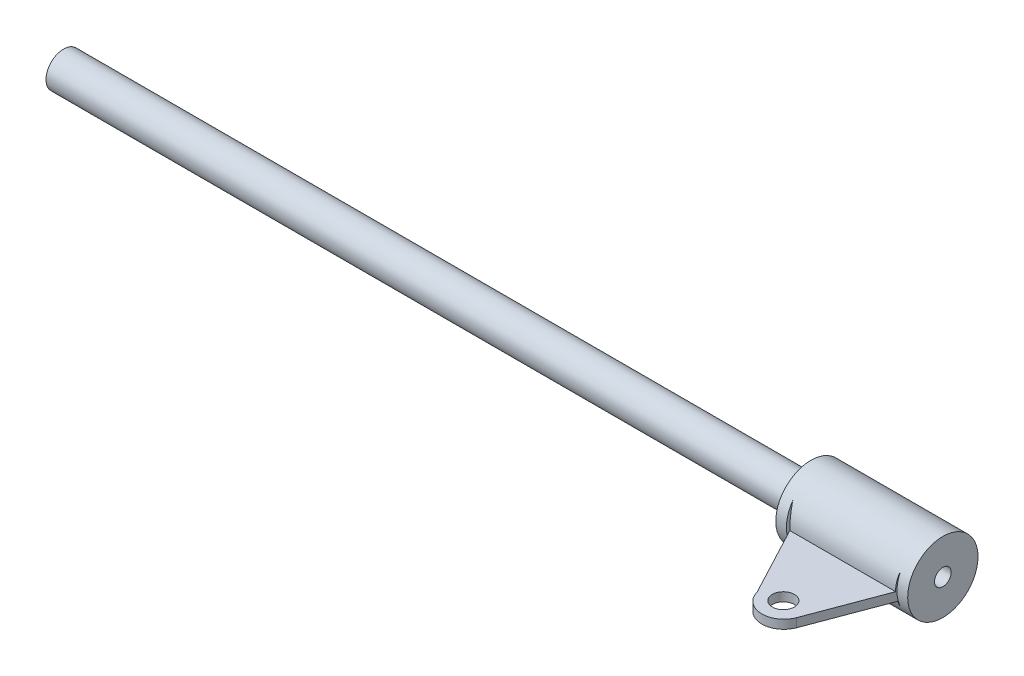
ISO-10303-21;
HEADER;
FILE_DESCRIPTION(('STEP AP214'),'2;1');
FILE_NAME('part.step','',(''),(''),'','','');
FILE_SCHEMA(('AUTOMOTIVE_DESIGN { 1 0 10303 214 1 1 1 1 }'));
ENDSEC;
DATA;
#1=APPLICATION_CONTEXT('core data for automotive mechanical design processes');
#2=APPLICATION_PROTOCOL_DEFINITION('international standard','automotive_design',2000,#1);
#3=PRODUCT_CONTEXT('',#1,'mechanical');
#4=PRODUCT('Part','Part','',(#3));
#5=PRODUCT_RELATED_PRODUCT_CATEGORY('part','',(#4));
#6=PRODUCT_DEFINITION_FORMATION('','',#4);
#7=PRODUCT_DEFINITION_CONTEXT('part definition',#1,'design');
#8=PRODUCT_DEFINITION('design','',#6,#7);
#9=PRODUCT_DEFINITION_SHAPE('','',#8);
#10=(LENGTH_UNIT() NAMED_UNIT(*) SI_UNIT(.MILLI.,.METRE.));
#11=(NAMED_UNIT(*) PLANE_ANGLE_UNIT() SI_UNIT($,.RADIAN.));
#12=(NAMED_UNIT(*) SI_UNIT($,.STERADIAN.) SOLID_ANGLE_UNIT());
#13=UNCERTAINTY_MEASURE_WITH_UNIT(LENGTH_MEASURE(1.E-05),#10,'distance_accuracy_value','');
#14=(GEOMETRIC_REPRESENTATION_CONTEXT(3) GLOBAL_UNCERTAINTY_ASSIGNED_CONTEXT((#13)) GLOBAL_UNIT_ASSIGNED_CONTEXT((#10,
#11,#12)) REPRESENTATION_CONTEXT('',''));
#15=CARTESIAN_POINT('',(0.,0.,0.));
#16=DIRECTION('',(0.,0.,1.));
#17=DIRECTION('',(1.,0.,0.));
#18=AXIS2_PLACEMENT_3D('',#15,#16,#17);
#19=CARTESIAN_POINT('',(1650.,55.7548476454296,0.));
#20=DIRECTION('',(1.,0.,0.));
#21=DIRECTION('',(0.,1.,0.));
#22=AXIS2_PLACEMENT_3D('',#19,#20,#21);
#23=CYLINDRICAL_SURFACE('',#22,80.0000000000002);
#24=CARTESIAN_POINT('',(1350.,55.7548476454296,0.));
#25=DIRECTION('',(1.,0.,0.));
#26=DIRECTION('',(0.,1.,0.));
#27=AXIS2_PLACEMENT_3D('',#24,#25,#26);
#28=CIRCLE('',#27,80.0000000000002);
#29=CARTESIAN_POINT('',(1350.,135.75484764543,0.));
#30=VERTEX_POINT('',#29);
#31=EDGE_CURVE('E189',#30,#30,#28,.T.);
#32=ORIENTED_EDGE('',*,*,#31,.T.);
#33=EDGE_LOOP('',(#32));
#34=FACE_BOUND('',#33,.T.);
#35=CARTESIAN_POINT('',(1650.,55.7548476454296,0.));
#36=DIRECTION('',(1.,0.,0.));
#37=DIRECTION('',(0.,1.,0.));
#38=AXIS2_PLACEMENT_3D('',#35,#36,#37);
#39=CIRCLE('',#38,80.0000000000001);
#40=CARTESIAN_POINT('',(1650.,135.75484764543,0.));
#41=VERTEX_POINT('',#40);
#42=EDGE_CURVE('E187',#41,#41,#39,.T.);
#43=ORIENTED_EDGE('',*,*,#42,.F.);
#44=EDGE_LOOP('',(#43));
#45=FACE_BOUND('',#44,.T.);
#46=CARTESIAN_POINT('',(1625.63364270783,55.7548476454296,0.));
#47=DIRECTION('',(1.,0.,0.));
#48=DIRECTION('',(0.,0.,-1.));
#49=AXIS2_PLACEMENT_3D('',#46,#47,#48);
#50=CIRCLE('',#49,80.0000000000002);
#51=CARTESIAN_POINT('',(1625.63364270783,90.8074530030054,71.9118547782358));
#52=VERTEX_POINT('',#51);
#53=CARTESIAN_POINT('',(1625.63364270783,20.7022422878538,71.9118547782358));
#54=VERTEX_POINT('',#53);
#55=EDGE_CURVE('E12',#52,#54,#50,.T.);
#56=ORIENTED_EDGE('',*,*,#55,.T.);
#57=CARTESIAN_POINT('',(1652.62193285122,55.7548476454296,0.));
#58=DIRECTION('',(-0.936237784607447,0.,-0.351367059744277));
#59=DIRECTION('',(0.351367059744278,0.,-0.936237784607448));
#60=AXIS2_PLACEMENT_3D('',#57,#58,#59);
#61=ELLIPSE('',#60,85.4483778750108,80.0000000000002);
#62=CARTESIAN_POINT('',(1623.82183479907,33.1485242621909,76.7395213895192));
#63=VERTEX_POINT('',#62);
#64=EDGE_CURVE('E155',#54,#63,#61,.T.);
#65=ORIENTED_EDGE('',*,*,#64,.T.);
#66=DIRECTION('',(1.,0.,0.));
#67=VECTOR('',#66,1.);
#68=CARTESIAN_POINT('',(1650.,33.1485242621909,76.7395213895191));
#69=LINE('',#68,#67);
#70=CARTESIAN_POINT('',(1380.23322892771,33.1485242621909,76.7395213895191));
#71=VERTEX_POINT('',#70);
#72=EDGE_CURVE('E149',#71,#63,#69,.T.);
#73=ORIENTED_EDGE('',*,*,#72,.F.);
#74=CARTESIAN_POINT('',(1339.5691789963,55.7548476454296,0.));
#75=DIRECTION('',(0.883610518249531,0.,-0.468222652205973));
#76=DIRECTION('',(0.468222652205973,0.,0.883610518249531));
#77=AXIS2_PLACEMENT_3D('',#74,#75,#76);
#78=ELLIPSE('',#77,90.5376275493907,80.0000000000002);
#79=CARTESIAN_POINT('',(1374.27765575097,9.82341564149599,65.500408808404));
#80=VERTEX_POINT('',#79);
#81=EDGE_CURVE('E142',#71,#80,#78,.T.);
#82=ORIENTED_EDGE('',*,*,#81,.T.);
#83=CARTESIAN_POINT('',(1374.27765575097,55.7548476454296,0.));
#84=DIRECTION('',(-1.,0.,0.));
#85=DIRECTION('',(0.,0.,1.));
#86=AXIS2_PLACEMENT_3D('',#83,#84,#85);
#87=CIRCLE('',#86,80.0000000000002);
#88=CARTESIAN_POINT('',(1374.27765575097,101.686279649363,65.500408808404));
#89=VERTEX_POINT('',#88);
#90=EDGE_CURVE('E88',#80,#89,#87,.T.);
#91=ORIENTED_EDGE('',*,*,#90,.T.);
#92=CARTESIAN_POINT('',(1381.93844393506,53.148524262191,79.9575329685828));
#93=VERTEX_POINT('',#92);
#94=EDGE_CURVE('E144',#89,#93,#78,.T.);
#95=ORIENTED_EDGE('',*,*,#94,.T.);
#96=DIRECTION('',(1.,0.,0.));
#97=VECTOR('',#96,1.);
#98=CARTESIAN_POINT('',(1650.,53.148524262191,79.9575329685828));
#99=LINE('',#98,#97);
#100=CARTESIAN_POINT('',(1622.61412529904,53.148524262191,79.9575329685828));
#101=VERTEX_POINT('',#100);
#102=EDGE_CURVE('E205',#101,#93,#99,.F.);
#103=ORIENTED_EDGE('',*,*,#102,.F.);
#104=EDGE_CURVE('E150',#101,#52,#61,.T.);
#105=ORIENTED_EDGE('',*,*,#104,.T.);
#106=EDGE_LOOP('',(#56,#65,#73,#82,#91,#95,#103,#105));
#107=FACE_BOUND('',#106,.T.);
#108=ADVANCED_FACE('F80',(#34,#45,#107),#23,.T.);
#109=CARTESIAN_POINT('',(-350.,15.7548476454294,0.));
#110=DIRECTION('',(1.,0.,0.));
#111=DIRECTION('',(0.,1.,0.));
#112=AXIS2_PLACEMENT_3D('',#109,#110,#111);
#113=PLANE('',#112);
#114=CARTESIAN_POINT('',(-350.,55.7548476454296,0.));
#115=DIRECTION('',(1.,0.,0.));
#116=DIRECTION('',(0.,0.,-1.));
#117=AXIS2_PLACEMENT_3D('',#114,#115,#116);
#118=CIRCLE('',#117,19.05);
#119=CARTESIAN_POINT('',(-350.,55.7548476454296,-19.05));
#120=VERTEX_POINT('',#119);
#121=EDGE_CURVE('E168',#120,#120,#118,.T.);
#122=ORIENTED_EDGE('',*,*,#121,.T.);
#123=EDGE_LOOP('',(#122));
#124=FACE_BOUND('',#123,.T.);
#125=CARTESIAN_POINT('',(-350.,55.7548476454294,0.));
#126=DIRECTION('',(1.,0.,0.));
#127=DIRECTION('',(0.,1.,0.));
#128=AXIS2_PLACEMENT_3D('',#125,#126,#127);
#129=CIRCLE('',#128,40.);
#130=CARTESIAN_POINT('',(-350.,95.7548476454294,0.));
#131=VERTEX_POINT('',#130);
#132=EDGE_CURVE('E202',#131,#131,#129,.T.);
#133=ORIENTED_EDGE('',*,*,#132,.F.);
#134=EDGE_LOOP('',(#133));
#135=FACE_BOUND('',#134,.T.);
#136=ADVANCED_FACE('F82',(#124,#135),#113,.F.);
#137=CARTESIAN_POINT('',(1650.,55.7548476454296,0.));
#138=DIRECTION('',(1.,0.,0.));
#139=DIRECTION('',(0.,1.,0.));
#140=AXIS2_PLACEMENT_3D('',#137,#138,#139);
#141=CYLINDRICAL_SURFACE('',#140,40.0000000000001);
#142=CARTESIAN_POINT('',(1350.,55.7548476454296,0.));
#143=DIRECTION('',(1.,0.,0.));
#144=DIRECTION('',(0.,1.,0.));
#145=AXIS2_PLACEMENT_3D('',#142,#143,#144);
#146=CIRCLE('',#145,40.0000000000002);
#147=CARTESIAN_POINT('',(1350.,95.7548476454298,0.));
#148=VERTEX_POINT('',#147);
#149=EDGE_CURVE('E193',#148,#148,#146,.T.);
#150=ORIENTED_EDGE('',*,*,#149,.F.);
#151=EDGE_LOOP('',(#150));
#152=FACE_BOUND('',#151,.T.);
#153=ORIENTED_EDGE('',*,*,#132,.T.);
#154=EDGE_LOOP('',(#153));
#155=FACE_BOUND('',#154,.T.);
#156=ADVANCED_FACE('F244',(#152,#155),#141,.T.);
#157=CARTESIAN_POINT('',(1350.,-24.2451523545706,0.));
#158=DIRECTION('',(1.,0.,0.));
#159=DIRECTION('',(0.,1.,0.));
#160=AXIS2_PLACEMENT_3D('',#157,#158,#159);
#161=PLANE('',#160);
#162=ORIENTED_EDGE('',*,*,#31,.F.);
#163=EDGE_LOOP('',(#162));
#164=FACE_BOUND('',#163,.T.);
#165=ORIENTED_EDGE('',*,*,#149,.T.);
#166=EDGE_LOOP('',(#165));
#167=FACE_BOUND('',#166,.T.);
#168=ADVANCED_FACE('F183',(#164,#167),#161,.F.);
#169=CARTESIAN_POINT('',(1650.,-24.2451523545705,0.));
#170=DIRECTION('',(-1.,0.,0.));
#171=DIRECTION('',(0.,-1.,0.));
#172=AXIS2_PLACEMENT_3D('',#169,#170,#171);
#173=PLANE('',#172);
#174=CARTESIAN_POINT('',(1650.,55.7548476454296,0.));
#175=DIRECTION('',(1.,0.,0.));
#176=DIRECTION('',(0.,0.,-1.));
#177=AXIS2_PLACEMENT_3D('',#174,#175,#176);
#178=CIRCLE('',#177,19.05);
#179=CARTESIAN_POINT('',(1650.,55.7548476454296,-19.05));
#180=VERTEX_POINT('',#179);
#181=EDGE_CURVE('E171',#180,#180,#178,.T.);
#182=ORIENTED_EDGE('',*,*,#181,.F.);
#183=EDGE_LOOP('',(#182));
#184=FACE_BOUND('',#183,.T.);
#185=ORIENTED_EDGE('',*,*,#42,.T.);
#186=EDGE_LOOP('',(#185));
#187=FACE_BOUND('',#186,.T.);
#188=ADVANCED_FACE('F179',(#184,#187),#173,.F.);
#189=CARTESIAN_POINT('',(1625.3013802483,33.1485242621909,400.));
#190=DIRECTION('',(0.,1.,0.));
#191=DIRECTION('',(0.,0.,1.));
#192=AXIS2_PLACEMENT_3D('',#189,#190,#191);
#193=PLANE('',#192);
#194=CARTESIAN_POINT('',(1512.64124876585,33.1485242621909,225.471244950654));
#195=DIRECTION('',(0.,1.,0.));
#196=DIRECTION('',(0.,0.,1.));
#197=AXIS2_PLACEMENT_3D('',#194,#195,#196);
#198=CIRCLE('',#197,25.);
#199=CARTESIAN_POINT('',(1512.64124876585,33.1485242621909,250.471244950654));
#200=VERTEX_POINT('',#199);
#201=EDGE_CURVE('E190',#200,#200,#198,.T.);
#202=ORIENTED_EDGE('',*,*,#201,.T.);
#203=EDGE_LOOP('',(#202));
#204=FACE_BOUND('',#203,.T.);
#205=ORIENTED_EDGE('',*,*,#72,.T.);
#206=DIRECTION('',(-0.351367059744278,0.,0.936237784607448));
#207=VECTOR('',#206,1.);
#208=CARTESIAN_POINT('',(1517.66372288032,33.1485242621909,359.603929889449));
#209=LINE('',#208,#207);
#210=CARTESIAN_POINT('',(1561.21093304073,33.1485242621909,243.569878216839));
#211=VERTEX_POINT('',#210);
#212=EDGE_CURVE('E103',#63,#211,#209,.T.);
#213=ORIENTED_EDGE('',*,*,#212,.T.);
#214=CARTESIAN_POINT('',(1514.39904381036,33.1485242621909,226.001525229624));
#215=DIRECTION('',(0.,1.,0.));
#216=DIRECTION('',(0.,0.,1.));
#217=AXIS2_PLACEMENT_3D('',#214,#215,#216);
#218=CIRCLE('',#217,50.);
#219=CARTESIAN_POINT('',(1466.02164239534,33.1485242621909,238.635884427056));
#220=VERTEX_POINT('',#219);
#221=EDGE_CURVE('E216',#220,#211,#218,.T.);
#222=ORIENTED_EDGE('',*,*,#221,.F.);
#223=DIRECTION('',(-0.468222652205973,0.,-0.883610518249531));
#224=VECTOR('',#223,1.);
#225=CARTESIAN_POINT('',(1567.70153425197,33.1485242621909,430.52199142274));
#226=LINE('',#225,#224);
#227=EDGE_CURVE('E151',#220,#71,#226,.T.);
#228=ORIENTED_EDGE('',*,*,#227,.T.);
#229=EDGE_LOOP('',(#205,#213,#222,#228));
#230=FACE_BOUND('',#229,.T.);
#231=ADVANCED_FACE('F182',(#204,#230),#193,.F.);
#232=CARTESIAN_POINT('',(1625.3013802483,53.148524262191,400.));
#233=DIRECTION('',(0.,-1.,0.));
#234=DIRECTION('',(1.,0.,0.));
#235=AXIS2_PLACEMENT_3D('',#232,#233,#234);
#236=PLANE('',#235);
#237=CARTESIAN_POINT('',(1512.64124876585,53.148524262191,225.471244950654));
#238=DIRECTION('',(0.,-1.,0.));
#239=DIRECTION('',(1.,0.,0.));
#240=AXIS2_PLACEMENT_3D('',#237,#238,#239);
#241=CIRCLE('',#240,25.);
#242=CARTESIAN_POINT('',(1512.64124876585,53.148524262191,250.471244950654));
#243=VERTEX_POINT('',#242);
#244=EDGE_CURVE('E196',#243,#243,#241,.T.);
#245=ORIENTED_EDGE('',*,*,#244,.T.);
#246=EDGE_LOOP('',(#245));
#247=FACE_BOUND('',#246,.T.);
#248=CARTESIAN_POINT('',(1514.39904381036,53.148524262191,226.001525229624));
#249=DIRECTION('',(0.,-1.,0.));
#250=DIRECTION('',(1.,0.,0.));
#251=AXIS2_PLACEMENT_3D('',#248,#249,#250);
#252=CIRCLE('',#251,50.);
#253=CARTESIAN_POINT('',(1561.21093304073,53.1485242621909,243.569878216839));
#254=VERTEX_POINT('',#253);
#255=CARTESIAN_POINT('',(1466.02164239534,53.148524262191,238.635884427056));
#256=VERTEX_POINT('',#255);
#257=EDGE_CURVE('E211',#254,#256,#252,.T.);
#258=ORIENTED_EDGE('',*,*,#257,.F.);
#259=DIRECTION('',(0.351367059744278,0.,-0.936237784607448));
#260=VECTOR('',#259,1.);
#261=CARTESIAN_POINT('',(1517.66372288032,53.148524262191,359.603929889449));
#262=LINE('',#261,#260);
#263=EDGE_CURVE('E140',#254,#101,#262,.T.);
#264=ORIENTED_EDGE('',*,*,#263,.T.);
#265=ORIENTED_EDGE('',*,*,#102,.T.);
#266=DIRECTION('',(0.468222652205973,0.,0.883610518249531));
#267=VECTOR('',#266,1.);
#268=CARTESIAN_POINT('',(1567.70153425197,53.148524262191,430.52199142274));
#269=LINE('',#268,#267);
#270=EDGE_CURVE('E208',#93,#256,#269,.T.);
#271=ORIENTED_EDGE('',*,*,#270,.T.);
#272=EDGE_LOOP('',(#258,#264,#265,#271));
#273=FACE_BOUND('',#272,.T.);
#274=ADVANCED_FACE('F224',(#247,#273),#236,.F.);
#275=CARTESIAN_POINT('',(1625.63364270783,-24.2451523545706,0.));
#276=DIRECTION('',(1.,0.,0.));
#277=DIRECTION('',(0.,0.,-1.));
#278=AXIS2_PLACEMENT_3D('',#275,#276,#277);
#279=PLANE('',#278);
#280=DIRECTION('',(0.,1.,0.));
#281=VECTOR('',#280,1.);
#282=CARTESIAN_POINT('',(1625.63364270783,-24.2451523545706,71.9118547782358));
#283=LINE('',#282,#281);
#284=EDGE_CURVE('E145',#54,#52,#283,.T.);
#285=ORIENTED_EDGE('',*,*,#284,.F.);
#286=ORIENTED_EDGE('',*,*,#55,.F.);
#287=EDGE_LOOP('',(#285,#286));
#288=FACE_BOUND('',#287,.T.);
#289=ADVANCED_FACE('F228',(#288),#279,.F.);
#290=CARTESIAN_POINT('',(1374.27765575097,-24.2451523545706,0.));
#291=DIRECTION('',(-1.,0.,0.));
#292=DIRECTION('',(0.,0.,1.));
#293=AXIS2_PLACEMENT_3D('',#290,#291,#292);
#294=PLANE('',#293);
#295=DIRECTION('',(0.,1.,0.));
#296=VECTOR('',#295,1.);
#297=CARTESIAN_POINT('',(1374.27765575097,-24.2451523545706,65.500408808404));
#298=LINE('',#297,#296);
#299=EDGE_CURVE('E136',#80,#89,#298,.T.);
#300=ORIENTED_EDGE('',*,*,#299,.T.);
#301=ORIENTED_EDGE('',*,*,#90,.F.);
#302=EDGE_LOOP('',(#300,#301));
#303=FACE_BOUND('',#302,.T.);
#304=ADVANCED_FACE('F135',(#303),#294,.F.);
#305=CARTESIAN_POINT('',(1514.39904381036,-24.2451523545706,226.001525229624));
#306=DIRECTION('',(0.,1.,0.));
#307=DIRECTION('',(0.,0.,1.));
#308=AXIS2_PLACEMENT_3D('',#305,#306,#307);
#309=CYLINDRICAL_SURFACE('',#308,50.);
#310=ORIENTED_EDGE('',*,*,#221,.T.);
#311=DIRECTION('',(0.,1.,0.));
#312=VECTOR('',#311,1.);
#313=CARTESIAN_POINT('',(1561.21093304073,-24.2451523545706,243.569878216839));
#314=LINE('',#313,#312);
#315=EDGE_CURVE('E158',#211,#254,#314,.T.);
#316=ORIENTED_EDGE('',*,*,#315,.T.);
#317=ORIENTED_EDGE('',*,*,#257,.T.);
#318=DIRECTION('',(0.,1.,0.));
#319=VECTOR('',#318,1.);
#320=CARTESIAN_POINT('',(1466.02164239534,-24.2451523545706,238.635884427056));
#321=LINE('',#320,#319);
#322=EDGE_CURVE('E95',#220,#256,#321,.T.);
#323=ORIENTED_EDGE('',*,*,#322,.F.);
#324=EDGE_LOOP('',(#310,#316,#317,#323));
#325=FACE_BOUND('',#324,.T.);
#326=ADVANCED_FACE('F222',(#325),#309,.T.);
#327=CARTESIAN_POINT('',(1448.59119452873,-24.2451523545706,543.651663243247));
#328=DIRECTION('',(-0.936237784607447,0.,-0.351367059744277));
#329=DIRECTION('',(-0.351367059744278,0.,0.936237784607448));
#330=AXIS2_PLACEMENT_3D('',#327,#328,#329);
#331=PLANE('',#330);
#332=ORIENTED_EDGE('',*,*,#284,.T.);
#333=ORIENTED_EDGE('',*,*,#104,.F.);
#334=ORIENTED_EDGE('',*,*,#263,.F.);
#335=ORIENTED_EDGE('',*,*,#315,.F.);
#336=ORIENTED_EDGE('',*,*,#212,.F.);
#337=ORIENTED_EDGE('',*,*,#64,.F.);
#338=EDGE_LOOP('',(#332,#333,#334,#335,#336,#337));
#339=FACE_BOUND('',#338,.T.);
#340=ADVANCED_FACE('F225',(#339),#331,.F.);
#341=CARTESIAN_POINT('',(1045.89214320934,-24.2451523545706,-554.215214849416));
#342=DIRECTION('',(0.883610518249531,0.,-0.468222652205973));
#343=DIRECTION('',(-0.468222652205973,0.,-0.883610518249531));
#344=AXIS2_PLACEMENT_3D('',#341,#342,#343);
#345=PLANE('',#344);
#346=ORIENTED_EDGE('',*,*,#227,.F.);
#347=ORIENTED_EDGE('',*,*,#322,.T.);
#348=ORIENTED_EDGE('',*,*,#270,.F.);
#349=ORIENTED_EDGE('',*,*,#94,.F.);
#350=ORIENTED_EDGE('',*,*,#299,.F.);
#351=ORIENTED_EDGE('',*,*,#81,.F.);
#352=EDGE_LOOP('',(#346,#347,#348,#349,#350,#351));
#353=FACE_BOUND('',#352,.T.);
#354=ADVANCED_FACE('F141',(#353),#345,.F.);
#355=CARTESIAN_POINT('',(1512.64124876585,-24.2451523545706,225.471244950654));
#356=DIRECTION('',(0.,1.,0.));
#357=DIRECTION('',(0.,0.,1.));
#358=AXIS2_PLACEMENT_3D('',#355,#356,#357);
#359=CYLINDRICAL_SURFACE('',#358,25.);
#360=CARTESIAN_POINT('',(1512.64124876585,53.148524262191,250.471244950654));
#361=CARTESIAN_POINT('',(1512.64124876585,52.9401909288576,250.471244950654));
#362=CARTESIAN_POINT('',(1512.64124876585,52.7318575955243,250.471244950654));
#363=CARTESIAN_POINT('',(1512.64124876585,52.3151909288576,250.471244950654));
#364=CARTESIAN_POINT('',(1512.64124876585,52.1068575955243,250.471244950654));
#365=CARTESIAN_POINT('',(1512.64124876585,51.6901909288576,250.471244950654));
#366=CARTESIAN_POINT('',(1512.64124876585,51.4818575955243,250.471244950654));
#367=CARTESIAN_POINT('',(1512.64124876585,51.0651909288576,250.471244950654));
#368=CARTESIAN_POINT('',(1512.64124876585,50.8568575955243,250.471244950654));
#369=CARTESIAN_POINT('',(1512.64124876585,50.4401909288576,250.471244950654));
#370=CARTESIAN_POINT('',(1512.64124876585,50.2318575955243,250.471244950654));
#371=CARTESIAN_POINT('',(1512.64124876585,49.8151909288576,250.471244950654));
#372=CARTESIAN_POINT('',(1512.64124876585,49.6068575955243,250.471244950654));
#373=CARTESIAN_POINT('',(1512.64124876585,49.1901909288576,250.471244950654));
#374=CARTESIAN_POINT('',(1512.64124876585,48.9818575955243,250.471244950654));
#375=CARTESIAN_POINT('',(1512.64124876585,48.5651909288576,250.471244950654));
#376=CARTESIAN_POINT('',(1512.64124876585,48.3568575955243,250.471244950654));
#377=CARTESIAN_POINT('',(1512.64124876585,47.9401909288576,250.471244950654));
#378=CARTESIAN_POINT('',(1512.64124876585,47.7318575955243,250.471244950654));
#379=CARTESIAN_POINT('',(1512.64124876585,47.3151909288576,250.471244950654));
#380=CARTESIAN_POINT('',(1512.64124876585,47.1068575955243,250.471244950654));
#381=CARTESIAN_POINT('',(1512.64124876585,46.6901909288576,250.471244950654));
#382=CARTESIAN_POINT('',(1512.64124876585,46.4818575955243,250.471244950654));
#383=CARTESIAN_POINT('',(1512.64124876585,46.0651909288576,250.471244950654));
#384=CARTESIAN_POINT('',(1512.64124876585,45.8568575955243,250.471244950654));
#385=CARTESIAN_POINT('',(1512.64124876585,45.4401909288576,250.471244950654));
#386=CARTESIAN_POINT('',(1512.64124876585,45.2318575955243,250.471244950654));
#387=CARTESIAN_POINT('',(1512.64124876585,44.8151909288576,250.471244950654));
#388=CARTESIAN_POINT('',(1512.64124876585,44.6068575955243,250.471244950654));
#389=CARTESIAN_POINT('',(1512.64124876585,44.1901909288576,250.471244950654));
#390=CARTESIAN_POINT('',(1512.64124876585,43.9818575955243,250.471244950654));
#391=CARTESIAN_POINT('',(1512.64124876585,43.5651909288576,250.471244950654));
#392=CARTESIAN_POINT('',(1512.64124876585,43.3568575955243,250.471244950654));
#393=CARTESIAN_POINT('',(1512.64124876585,42.9401909288576,250.471244950654));
#394=CARTESIAN_POINT('',(1512.64124876585,42.7318575955243,250.471244950654));
#395=CARTESIAN_POINT('',(1512.64124876585,42.3151909288576,250.471244950654));
#396=CARTESIAN_POINT('',(1512.64124876585,42.1068575955243,250.471244950654));
#397=CARTESIAN_POINT('',(1512.64124876585,41.6901909288576,250.471244950654));
#398=CARTESIAN_POINT('',(1512.64124876585,41.4818575955243,250.471244950654));
#399=CARTESIAN_POINT('',(1512.64124876585,41.0651909288576,250.471244950654));
#400=CARTESIAN_POINT('',(1512.64124876585,40.8568575955243,250.471244950654));
#401=CARTESIAN_POINT('',(1512.64124876585,40.4401909288576,250.471244950654));
#402=CARTESIAN_POINT('',(1512.64124876585,40.2318575955243,250.471244950654));
#403=CARTESIAN_POINT('',(1512.64124876585,39.8151909288576,250.471244950654));
#404=CARTESIAN_POINT('',(1512.64124876585,39.6068575955243,250.471244950654));
#405=CARTESIAN_POINT('',(1512.64124876585,39.1901909288576,250.471244950654));
#406=CARTESIAN_POINT('',(1512.64124876585,38.9818575955243,250.471244950654));
#407=CARTESIAN_POINT('',(1512.64124876585,38.5651909288576,250.471244950654));
#408=CARTESIAN_POINT('',(1512.64124876585,38.3568575955243,250.471244950654));
#409=CARTESIAN_POINT('',(1512.64124876585,37.9401909288576,250.471244950654));
#410=CARTESIAN_POINT('',(1512.64124876585,37.7318575955243,250.471244950654));
#411=CARTESIAN_POINT('',(1512.64124876585,37.3151909288576,250.471244950654));
#412=CARTESIAN_POINT('',(1512.64124876585,37.1068575955243,250.471244950654));
#413=CARTESIAN_POINT('',(1512.64124876585,36.6901909288576,250.471244950654));
#414=CARTESIAN_POINT('',(1512.64124876585,36.4818575955243,250.471244950654));
#415=CARTESIAN_POINT('',(1512.64124876585,36.0651909288576,250.471244950654));
#416=CARTESIAN_POINT('',(1512.64124876585,35.8568575955243,250.471244950654));
#417=CARTESIAN_POINT('',(1512.64124876585,35.4401909288576,250.471244950654));
#418=CARTESIAN_POINT('',(1512.64124876585,35.2318575955243,250.471244950654));
#419=CARTESIAN_POINT('',(1512.64124876585,34.8151909288576,250.471244950654));
#420=CARTESIAN_POINT('',(1512.64124876585,34.6068575955243,250.471244950654));
#421=CARTESIAN_POINT('',(1512.64124876585,34.1901909288576,250.471244950654));
#422=CARTESIAN_POINT('',(1512.64124876585,33.9818575955243,250.471244950654));
#423=CARTESIAN_POINT('',(1512.64124876585,33.5651909288576,250.471244950654));
#424=CARTESIAN_POINT('',(1512.64124876585,33.3568575955243,250.471244950654));
#425=CARTESIAN_POINT('',(1512.64124876585,33.1485242621909,250.471244950654));
#426=B_SPLINE_CURVE_WITH_KNOTS('',3,(#360,#361,#362,#363,#364,#365,#366,#367,#368,#369,#370,
#371,#372,#373,#374,#375,#376,#377,#378,#379,#380,#381,#382,#383,#384,#385,#386,#387,#388,#389,
#390,#391,#392,#393,#394,#395,#396,#397,#398,#399,#400,#401,#402,#403,#404,#405,#406,#407,#408,
#409,#410,#411,#412,#413,#414,#415,#416,#417,#418,#419,#420,#421,#422,#423,#424,#425),
.UNSPECIFIED.,.F.,.F.,(4,2,2,2,2,2,2,2,2,2,2,2,2,2,2,2,2,2,2,2,2,2,2,2,2,2,2,2,2,2,2,2,4),(0.,
0.625000000000001,1.25,1.875,2.5,3.125,3.75,4.375,5.,5.62500000000001,6.25000000000001,
6.87500000000001,7.50000000000001,8.12500000000001,8.75000000000001,9.37500000000002,10.,10.625,
11.25,11.875,12.5,13.125,13.75,14.375,15.,15.625,16.25,16.875,17.5,18.125,18.75,19.375,20.),.UNSPECIFIED.);
#427=EDGE_CURVE('BSEAM312',#243,#200,#426,.T.);
#428=ORIENTED_EDGE('',*,*,#244,.F.);
#429=ORIENTED_EDGE('',*,*,#201,.F.);
#430=ORIENTED_EDGE('',*,*,#427,.T.);
#431=ORIENTED_EDGE('',*,*,#427,.F.);
#432=EDGE_LOOP('',(#428,#430,#429,#431));
#433=FACE_BOUND('',#432,.T.);
#434=ADVANCED_FACE('F312',(#433),#359,.F.);
#435=CARTESIAN_POINT('',(-350.,55.7548476454296,0.));
#436=DIRECTION('',(1.,0.,0.));
#437=DIRECTION('',(0.,0.,-1.));
#438=AXIS2_PLACEMENT_3D('',#435,#436,#437);
#439=CYLINDRICAL_SURFACE('',#438,19.05);
#440=ORIENTED_EDGE('',*,*,#121,.F.);
#441=EDGE_LOOP('',(#440));
#442=FACE_BOUND('',#441,.T.);
#443=ORIENTED_EDGE('',*,*,#181,.T.);
#444=EDGE_LOOP('',(#443));
#445=FACE_BOUND('',#444,.T.);
#446=ADVANCED_FACE('F177',(#442,#445),#439,.F.);
#447=CLOSED_SHELL('',(#108,#136,#156,#168,#188,#231,#274,#289,#304,#326,#340,#354,#434,#446));
#448=MANIFOLD_SOLID_BREP('B2',#447);
#449=ADVANCED_BREP_SHAPE_REPRESENTATION('',(#18,#448),#14);
#450=SHAPE_DEFINITION_REPRESENTATION(#9,#449);
ENDSEC;
END-ISO-10303-21;
